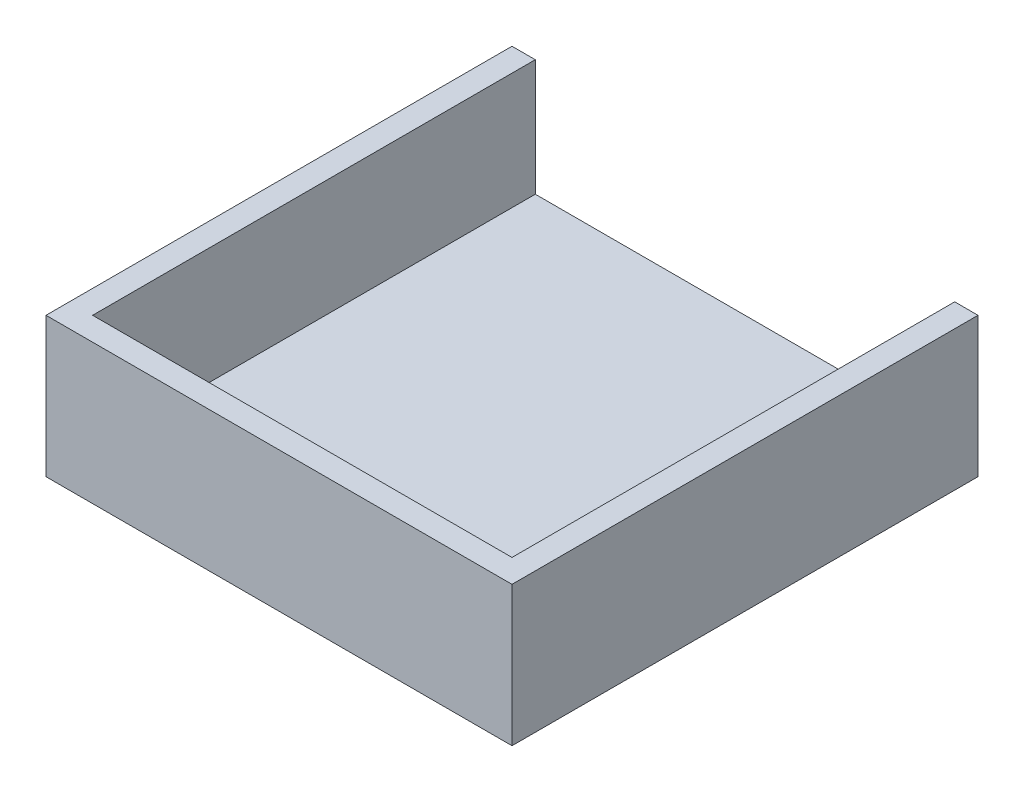
ISO-10303-21;
HEADER;
FILE_DESCRIPTION(('STEP AP214'),'2;1');
FILE_NAME('part.step','',(''),(''),'','','');
FILE_SCHEMA(('AUTOMOTIVE_DESIGN { 1 0 10303 214 1 1 1 1 }'));
ENDSEC;
DATA;
#1=APPLICATION_CONTEXT('core data for automotive mechanical design processes');
#2=APPLICATION_PROTOCOL_DEFINITION('international standard','automotive_design',2000,#1);
#3=PRODUCT_CONTEXT('',#1,'mechanical');
#4=PRODUCT('Part','Part','',(#3));
#5=PRODUCT_RELATED_PRODUCT_CATEGORY('part','',(#4));
#6=PRODUCT_DEFINITION_FORMATION('','',#4);
#7=PRODUCT_DEFINITION_CONTEXT('part definition',#1,'design');
#8=PRODUCT_DEFINITION('design','',#6,#7);
#9=PRODUCT_DEFINITION_SHAPE('','',#8);
#10=(LENGTH_UNIT() NAMED_UNIT(*) SI_UNIT(.MILLI.,.METRE.));
#11=(NAMED_UNIT(*) PLANE_ANGLE_UNIT() SI_UNIT($,.RADIAN.));
#12=(NAMED_UNIT(*) SI_UNIT($,.STERADIAN.) SOLID_ANGLE_UNIT());
#13=UNCERTAINTY_MEASURE_WITH_UNIT(LENGTH_MEASURE(1.E-05),#10,'distance_accuracy_value','');
#14=(GEOMETRIC_REPRESENTATION_CONTEXT(3) GLOBAL_UNCERTAINTY_ASSIGNED_CONTEXT((#13)) GLOBAL_UNIT_ASSIGNED_CONTEXT((#10,
#11,#12)) REPRESENTATION_CONTEXT('',''));
#15=CARTESIAN_POINT('',(0.,0.,0.));
#16=DIRECTION('',(0.,0.,1.));
#17=DIRECTION('',(1.,0.,0.));
#18=AXIS2_PLACEMENT_3D('',#15,#16,#17);
#19=CARTESIAN_POINT('',(10.,6.,-10.));
#20=DIRECTION('',(0.,0.,1.));
#21=DIRECTION('',(1.,0.,0.));
#22=AXIS2_PLACEMENT_3D('',#19,#20,#21);
#23=PLANE('',#22);
#24=DIRECTION('',(0.,-1.,0.));
#25=VECTOR('',#24,1.);
#26=CARTESIAN_POINT('',(-9.00000000000001,7.,-10.));
#27=LINE('',#26,#25);
#28=CARTESIAN_POINT('',(-9.00000000000001,6.,-10.));
#29=VERTEX_POINT('',#28);
#30=CARTESIAN_POINT('',(-9.00000000000001,1.,-10.));
#31=VERTEX_POINT('',#30);
#32=EDGE_CURVE('E132',#29,#31,#27,.T.);
#33=ORIENTED_EDGE('',*,*,#32,.T.);
#34=DIRECTION('',(-1.,0.,0.));
#35=VECTOR('',#34,1.);
#36=CARTESIAN_POINT('',(-9.00000000000001,1.,-10.));
#37=LINE('',#36,#35);
#38=CARTESIAN_POINT('',(8.99999999999999,1.,-10.));
#39=VERTEX_POINT('',#38);
#40=EDGE_CURVE('E127',#39,#31,#37,.T.);
#41=ORIENTED_EDGE('',*,*,#40,.F.);
#42=DIRECTION('',(0.,-1.,0.));
#43=VECTOR('',#42,1.);
#44=CARTESIAN_POINT('',(8.99999999999999,7.,-10.));
#45=LINE('',#44,#43);
#46=CARTESIAN_POINT('',(8.99999999999999,6.,-10.));
#47=VERTEX_POINT('',#46);
#48=EDGE_CURVE('E134',#47,#39,#45,.T.);
#49=ORIENTED_EDGE('',*,*,#48,.F.);
#50=DIRECTION('',(-1.,0.,0.));
#51=VECTOR('',#50,1.);
#52=CARTESIAN_POINT('',(10.,6.,-10.));
#53=LINE('',#52,#51);
#54=CARTESIAN_POINT('',(10.,6.,-10.));
#55=VERTEX_POINT('',#54);
#56=EDGE_CURVE('E142',#55,#47,#53,.T.);
#57=ORIENTED_EDGE('',*,*,#56,.F.);
#58=DIRECTION('',(0.,-1.,0.));
#59=VECTOR('',#58,1.);
#60=CARTESIAN_POINT('',(10.,6.,-10.));
#61=LINE('',#60,#59);
#62=CARTESIAN_POINT('',(10.,0.,-10.));
#63=VERTEX_POINT('',#62);
#64=EDGE_CURVE('E154',#55,#63,#61,.T.);
#65=ORIENTED_EDGE('',*,*,#64,.T.);
#66=DIRECTION('',(-1.,0.,0.));
#67=VECTOR('',#66,1.);
#68=CARTESIAN_POINT('',(10.,0.,-10.));
#69=LINE('',#68,#67);
#70=CARTESIAN_POINT('',(-10.,0.,-10.));
#71=VERTEX_POINT('',#70);
#72=EDGE_CURVE('E78',#63,#71,#69,.T.);
#73=ORIENTED_EDGE('',*,*,#72,.T.);
#74=DIRECTION('',(0.,-1.,0.));
#75=VECTOR('',#74,1.);
#76=CARTESIAN_POINT('',(-10.,6.,-10.));
#77=LINE('',#76,#75);
#78=CARTESIAN_POINT('',(-10.,6.,-10.));
#79=VERTEX_POINT('',#78);
#80=EDGE_CURVE('E145',#79,#71,#77,.T.);
#81=ORIENTED_EDGE('',*,*,#80,.F.);
#82=EDGE_CURVE('E56',#29,#79,#53,.T.);
#83=ORIENTED_EDGE('',*,*,#82,.F.);
#84=EDGE_LOOP('',(#33,#41,#49,#57,#65,#73,#81,#83));
#85=FACE_BOUND('',#84,.T.);
#86=ADVANCED_FACE('F33',(#85),#23,.F.);
#87=CARTESIAN_POINT('',(0.,6.,0.));
#88=DIRECTION('',(0.,1.,0.));
#89=DIRECTION('',(0.,0.,1.));
#90=AXIS2_PLACEMENT_3D('',#87,#88,#89);
#91=PLANE('',#90);
#92=DIRECTION('',(-1.,0.,0.));
#93=VECTOR('',#92,1.);
#94=CARTESIAN_POINT('',(0.,6.,9.));
#95=LINE('',#94,#93);
#96=CARTESIAN_POINT('',(9.,6.,9.));
#97=VERTEX_POINT('',#96);
#98=CARTESIAN_POINT('',(-9.,6.,9.));
#99=VERTEX_POINT('',#98);
#100=EDGE_CURVE('E41',#97,#99,#95,.T.);
#101=ORIENTED_EDGE('',*,*,#100,.T.);
#102=DIRECTION('',(0.,0.,-1.));
#103=VECTOR('',#102,1.);
#104=CARTESIAN_POINT('',(-9.,6.,0.));
#105=LINE('',#104,#103);
#106=EDGE_CURVE('E11',#99,#29,#105,.T.);
#107=ORIENTED_EDGE('',*,*,#106,.T.);
#108=ORIENTED_EDGE('',*,*,#82,.T.);
#109=DIRECTION('',(0.,0.,1.));
#110=VECTOR('',#109,1.);
#111=CARTESIAN_POINT('',(-10.,6.,10.));
#112=LINE('',#111,#110);
#113=CARTESIAN_POINT('',(-10.,6.,10.));
#114=VERTEX_POINT('',#113);
#115=EDGE_CURVE('E137',#79,#114,#112,.T.);
#116=ORIENTED_EDGE('',*,*,#115,.T.);
#117=DIRECTION('',(1.,0.,0.));
#118=VECTOR('',#117,1.);
#119=CARTESIAN_POINT('',(10.,6.,10.));
#120=LINE('',#119,#118);
#121=CARTESIAN_POINT('',(10.,6.,10.));
#122=VERTEX_POINT('',#121);
#123=EDGE_CURVE('E86',#114,#122,#120,.T.);
#124=ORIENTED_EDGE('',*,*,#123,.T.);
#125=DIRECTION('',(0.,0.,-1.));
#126=VECTOR('',#125,1.);
#127=CARTESIAN_POINT('',(10.,6.,10.));
#128=LINE('',#127,#126);
#129=EDGE_CURVE('E140',#122,#55,#128,.T.);
#130=ORIENTED_EDGE('',*,*,#129,.T.);
#131=ORIENTED_EDGE('',*,*,#56,.T.);
#132=DIRECTION('',(0.,0.,1.));
#133=VECTOR('',#132,1.);
#134=CARTESIAN_POINT('',(9.,6.,0.));
#135=LINE('',#134,#133);
#136=EDGE_CURVE('E161',#47,#97,#135,.T.);
#137=ORIENTED_EDGE('',*,*,#136,.T.);
#138=EDGE_LOOP('',(#101,#107,#108,#116,#124,#130,#131,#137));
#139=FACE_BOUND('',#138,.T.);
#140=ADVANCED_FACE('F163',(#139),#91,.T.);
#141=CARTESIAN_POINT('',(-10.,6.,10.));
#142=DIRECTION('',(1.,0.,0.));
#143=DIRECTION('',(0.,0.,-1.));
#144=AXIS2_PLACEMENT_3D('',#141,#142,#143);
#145=PLANE('',#144);
#146=DIRECTION('',(0.,0.,1.));
#147=VECTOR('',#146,1.);
#148=CARTESIAN_POINT('',(-10.,0.,10.));
#149=LINE('',#148,#147);
#150=CARTESIAN_POINT('',(-10.,0.,10.));
#151=VERTEX_POINT('',#150);
#152=EDGE_CURVE('E116',#71,#151,#149,.T.);
#153=ORIENTED_EDGE('',*,*,#152,.T.);
#154=DIRECTION('',(0.,-1.,0.));
#155=VECTOR('',#154,1.);
#156=CARTESIAN_POINT('',(-10.,6.,10.));
#157=LINE('',#156,#155);
#158=EDGE_CURVE('E159',#114,#151,#157,.T.);
#159=ORIENTED_EDGE('',*,*,#158,.F.);
#160=ORIENTED_EDGE('',*,*,#115,.F.);
#161=ORIENTED_EDGE('',*,*,#80,.T.);
#162=EDGE_LOOP('',(#153,#159,#160,#161));
#163=FACE_BOUND('',#162,.T.);
#164=ADVANCED_FACE('F35',(#163),#145,.F.);
#165=CARTESIAN_POINT('',(10.,6.,10.));
#166=DIRECTION('',(0.,0.,-1.));
#167=DIRECTION('',(-1.,0.,0.));
#168=AXIS2_PLACEMENT_3D('',#165,#166,#167);
#169=PLANE('',#168);
#170=DIRECTION('',(1.,0.,0.));
#171=VECTOR('',#170,1.);
#172=CARTESIAN_POINT('',(10.,0.,10.));
#173=LINE('',#172,#171);
#174=CARTESIAN_POINT('',(10.,0.,10.));
#175=VERTEX_POINT('',#174);
#176=EDGE_CURVE('E148',#151,#175,#173,.T.);
#177=ORIENTED_EDGE('',*,*,#176,.T.);
#178=DIRECTION('',(0.,-1.,0.));
#179=VECTOR('',#178,1.);
#180=CARTESIAN_POINT('',(10.,6.,10.));
#181=LINE('',#180,#179);
#182=EDGE_CURVE('E156',#122,#175,#181,.T.);
#183=ORIENTED_EDGE('',*,*,#182,.F.);
#184=ORIENTED_EDGE('',*,*,#123,.F.);
#185=ORIENTED_EDGE('',*,*,#158,.T.);
#186=EDGE_LOOP('',(#177,#183,#184,#185));
#187=FACE_BOUND('',#186,.T.);
#188=ADVANCED_FACE('F173',(#187),#169,.F.);
#189=CARTESIAN_POINT('',(10.,6.,10.));
#190=DIRECTION('',(-1.,0.,0.));
#191=DIRECTION('',(0.,0.,1.));
#192=AXIS2_PLACEMENT_3D('',#189,#190,#191);
#193=PLANE('',#192);
#194=DIRECTION('',(0.,0.,-1.));
#195=VECTOR('',#194,1.);
#196=CARTESIAN_POINT('',(10.,0.,10.));
#197=LINE('',#196,#195);
#198=EDGE_CURVE('E150',#175,#63,#197,.T.);
#199=ORIENTED_EDGE('',*,*,#198,.T.);
#200=ORIENTED_EDGE('',*,*,#64,.F.);
#201=ORIENTED_EDGE('',*,*,#129,.F.);
#202=ORIENTED_EDGE('',*,*,#182,.T.);
#203=EDGE_LOOP('',(#199,#200,#201,#202));
#204=FACE_BOUND('',#203,.T.);
#205=ADVANCED_FACE('F176',(#204),#193,.F.);
#206=CARTESIAN_POINT('',(0.,0.,0.));
#207=DIRECTION('',(0.,1.,0.));
#208=DIRECTION('',(0.,0.,1.));
#209=AXIS2_PLACEMENT_3D('',#206,#207,#208);
#210=PLANE('',#209);
#211=ORIENTED_EDGE('',*,*,#152,.F.);
#212=ORIENTED_EDGE('',*,*,#72,.F.);
#213=ORIENTED_EDGE('',*,*,#198,.F.);
#214=ORIENTED_EDGE('',*,*,#176,.F.);
#215=EDGE_LOOP('',(#211,#212,#213,#214));
#216=FACE_BOUND('',#215,.T.);
#217=ADVANCED_FACE('F178',(#216),#210,.F.);
#218=CARTESIAN_POINT('',(-9.00000000000001,7.,-10.));
#219=DIRECTION('',(1.,0.,0.));
#220=DIRECTION('',(0.,0.,-1.));
#221=AXIS2_PLACEMENT_3D('',#218,#219,#220);
#222=PLANE('',#221);
#223=DIRECTION('',(0.,-1.,0.));
#224=VECTOR('',#223,1.);
#225=CARTESIAN_POINT('',(-9.,7.,9.));
#226=LINE('',#225,#224);
#227=CARTESIAN_POINT('',(-9.,1.,9.));
#228=VERTEX_POINT('',#227);
#229=EDGE_CURVE('E108',#99,#228,#226,.T.);
#230=ORIENTED_EDGE('',*,*,#229,.T.);
#231=DIRECTION('',(0.,0.,1.));
#232=VECTOR('',#231,1.);
#233=CARTESIAN_POINT('',(-9.00000000000001,1.,-10.));
#234=LINE('',#233,#232);
#235=EDGE_CURVE('E112',#31,#228,#234,.T.);
#236=ORIENTED_EDGE('',*,*,#235,.F.);
#237=ORIENTED_EDGE('',*,*,#32,.F.);
#238=ORIENTED_EDGE('',*,*,#106,.F.);
#239=EDGE_LOOP('',(#230,#236,#237,#238));
#240=FACE_BOUND('',#239,.T.);
#241=ADVANCED_FACE('F110',(#240),#222,.T.);
#242=CARTESIAN_POINT('',(-9.,7.,9.));
#243=DIRECTION('',(0.,0.,-1.));
#244=DIRECTION('',(-1.,0.,0.));
#245=AXIS2_PLACEMENT_3D('',#242,#243,#244);
#246=PLANE('',#245);
#247=DIRECTION('',(0.,-1.,0.));
#248=VECTOR('',#247,1.);
#249=CARTESIAN_POINT('',(9.,7.,9.));
#250=LINE('',#249,#248);
#251=CARTESIAN_POINT('',(9.,1.,9.));
#252=VERTEX_POINT('',#251);
#253=EDGE_CURVE('E48',#97,#252,#250,.T.);
#254=ORIENTED_EDGE('',*,*,#253,.T.);
#255=DIRECTION('',(1.,0.,0.));
#256=VECTOR('',#255,1.);
#257=CARTESIAN_POINT('',(-9.,1.,9.));
#258=LINE('',#257,#256);
#259=EDGE_CURVE('E119',#228,#252,#258,.T.);
#260=ORIENTED_EDGE('',*,*,#259,.F.);
#261=ORIENTED_EDGE('',*,*,#229,.F.);
#262=ORIENTED_EDGE('',*,*,#100,.F.);
#263=EDGE_LOOP('',(#254,#260,#261,#262));
#264=FACE_BOUND('',#263,.T.);
#265=ADVANCED_FACE('F120',(#264),#246,.T.);
#266=CARTESIAN_POINT('',(8.99999999999999,7.,-10.));
#267=DIRECTION('',(-1.,0.,0.));
#268=DIRECTION('',(0.,0.,1.));
#269=AXIS2_PLACEMENT_3D('',#266,#267,#268);
#270=PLANE('',#269);
#271=ORIENTED_EDGE('',*,*,#48,.T.);
#272=DIRECTION('',(0.,0.,-1.));
#273=VECTOR('',#272,1.);
#274=CARTESIAN_POINT('',(8.99999999999999,1.,-10.));
#275=LINE('',#274,#273);
#276=EDGE_CURVE('E123',#252,#39,#275,.T.);
#277=ORIENTED_EDGE('',*,*,#276,.F.);
#278=ORIENTED_EDGE('',*,*,#253,.F.);
#279=ORIENTED_EDGE('',*,*,#136,.F.);
#280=EDGE_LOOP('',(#271,#277,#278,#279));
#281=FACE_BOUND('',#280,.T.);
#282=ADVANCED_FACE('F166',(#281),#270,.T.);
#283=CARTESIAN_POINT('',(0.,1.,0.));
#284=DIRECTION('',(0.,1.,0.));
#285=DIRECTION('',(0.,0.,1.));
#286=AXIS2_PLACEMENT_3D('',#283,#284,#285);
#287=PLANE('',#286);
#288=ORIENTED_EDGE('',*,*,#235,.T.);
#289=ORIENTED_EDGE('',*,*,#259,.T.);
#290=ORIENTED_EDGE('',*,*,#276,.T.);
#291=ORIENTED_EDGE('',*,*,#40,.T.);
#292=EDGE_LOOP('',(#288,#289,#290,#291));
#293=FACE_BOUND('',#292,.T.);
#294=ADVANCED_FACE('F125',(#293),#287,.T.);
#295=CLOSED_SHELL('',(#86,#140,#164,#188,#205,#217,#241,#265,#282,#294));
#296=MANIFOLD_SOLID_BREP('B2',#295);
#297=ADVANCED_BREP_SHAPE_REPRESENTATION('',(#18,#296),#14);
#298=SHAPE_DEFINITION_REPRESENTATION(#9,#297);
ENDSEC;
END-ISO-10303-21;
